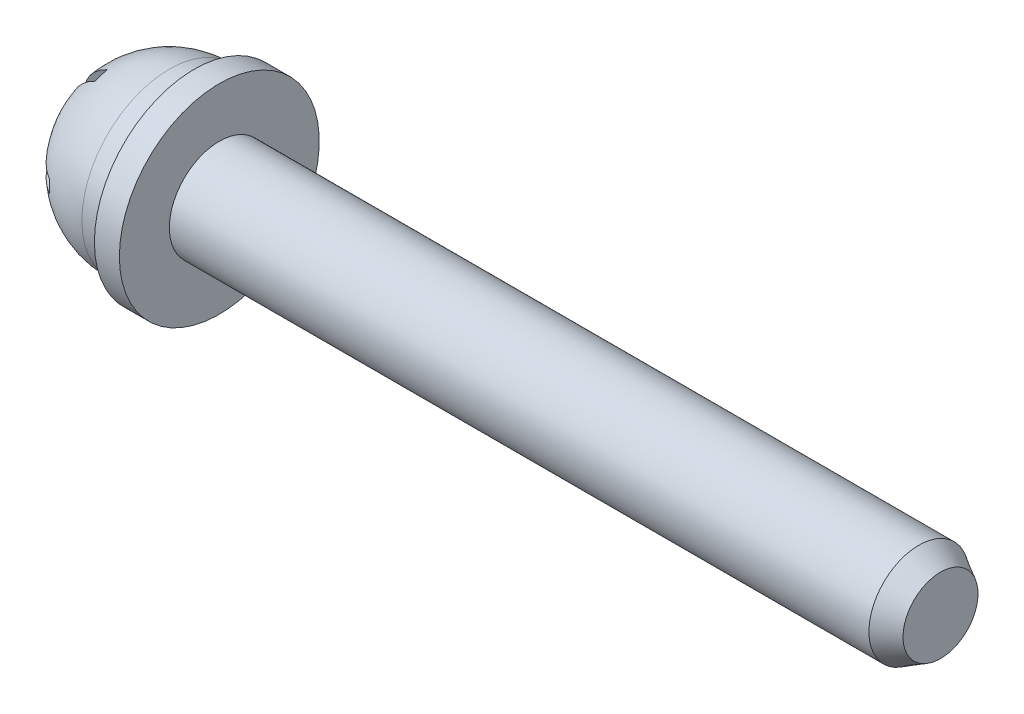
ISO-10303-21;
HEADER;
FILE_DESCRIPTION(('STEP AP214'),'2;1');
FILE_NAME('part.step','',(''),(''),'','','');
FILE_SCHEMA(('AUTOMOTIVE_DESIGN { 1 0 10303 214 1 1 1 1 }'));
ENDSEC;
DATA;
#1=APPLICATION_CONTEXT('core data for automotive mechanical design processes');
#2=APPLICATION_PROTOCOL_DEFINITION('international standard','automotive_design',2000,#1);
#3=PRODUCT_CONTEXT('',#1,'mechanical');
#4=PRODUCT('Part','Part','',(#3));
#5=PRODUCT_RELATED_PRODUCT_CATEGORY('part','',(#4));
#6=PRODUCT_DEFINITION_FORMATION('','',#4);
#7=PRODUCT_DEFINITION_CONTEXT('part definition',#1,'design');
#8=PRODUCT_DEFINITION('design','',#6,#7);
#9=PRODUCT_DEFINITION_SHAPE('','',#8);
#10=(LENGTH_UNIT() NAMED_UNIT(*) SI_UNIT(.MILLI.,.METRE.));
#11=(NAMED_UNIT(*) PLANE_ANGLE_UNIT() SI_UNIT($,.RADIAN.));
#12=(NAMED_UNIT(*) SI_UNIT($,.STERADIAN.) SOLID_ANGLE_UNIT());
#13=UNCERTAINTY_MEASURE_WITH_UNIT(LENGTH_MEASURE(1.E-05),#10,'distance_accuracy_value','');
#14=(GEOMETRIC_REPRESENTATION_CONTEXT(3) GLOBAL_UNCERTAINTY_ASSIGNED_CONTEXT((#13)) GLOBAL_UNIT_ASSIGNED_CONTEXT((#10,
#11,#12)) REPRESENTATION_CONTEXT('',''));
#15=CARTESIAN_POINT('',(0.,0.,0.));
#16=DIRECTION('',(0.,0.,1.));
#17=DIRECTION('',(1.,0.,0.));
#18=AXIS2_PLACEMENT_3D('',#15,#16,#17);
#19=CARTESIAN_POINT('',(-14.,0.,0.));
#20=DIRECTION('',(-1.,0.,0.));
#21=DIRECTION('',(0.,0.,1.));
#22=AXIS2_PLACEMENT_3D('',#19,#20,#21);
#23=CYLINDRICAL_SURFACE('',#22,4.);
#24=CARTESIAN_POINT('',(-14.,0.,0.));
#25=DIRECTION('',(-1.,0.,0.));
#26=DIRECTION('',(0.,0.,1.));
#27=AXIS2_PLACEMENT_3D('',#24,#25,#26);
#28=CIRCLE('',#27,4.);
#29=CARTESIAN_POINT('',(-14.,0.,4.));
#30=VERTEX_POINT('',#29);
#31=EDGE_CURVE('E265',#30,#30,#28,.T.);
#32=ORIENTED_EDGE('',*,*,#31,.T.);
#33=EDGE_LOOP('',(#32));
#34=FACE_BOUND('',#33,.T.);
#35=CARTESIAN_POINT('',(-15.,0.,0.));
#36=DIRECTION('',(-1.,0.,0.));
#37=DIRECTION('',(0.,0.,1.));
#38=AXIS2_PLACEMENT_3D('',#35,#36,#37);
#39=CIRCLE('',#38,4.);
#40=CARTESIAN_POINT('',(-15.,0.,4.));
#41=VERTEX_POINT('',#40);
#42=EDGE_CURVE('E260',#41,#41,#39,.T.);
#43=ORIENTED_EDGE('',*,*,#42,.F.);
#44=EDGE_LOOP('',(#43));
#45=FACE_BOUND('',#44,.T.);
#46=ADVANCED_FACE('F41',(#34,#45),#23,.T.);
#47=CARTESIAN_POINT('',(-14.,4.,0.));
#48=DIRECTION('',(1.,0.,0.));
#49=DIRECTION('',(0.,0.,-1.));
#50=AXIS2_PLACEMENT_3D('',#47,#48,#49);
#51=PLANE('',#50);
#52=CARTESIAN_POINT('',(-14.,0.,0.));
#53=DIRECTION('',(1.,0.,0.));
#54=DIRECTION('',(0.,0.,-1.));
#55=AXIS2_PLACEMENT_3D('',#52,#53,#54);
#56=CIRCLE('',#55,2.);
#57=CARTESIAN_POINT('',(-14.,0.,-2.));
#58=VERTEX_POINT('',#57);
#59=EDGE_CURVE('E261',#58,#58,#56,.T.);
#60=ORIENTED_EDGE('',*,*,#59,.F.);
#61=EDGE_LOOP('',(#60));
#62=FACE_BOUND('',#61,.T.);
#63=ORIENTED_EDGE('',*,*,#31,.F.);
#64=EDGE_LOOP('',(#63));
#65=FACE_BOUND('',#64,.T.);
#66=ADVANCED_FACE('F305',(#62,#65),#51,.T.);
#67=CARTESIAN_POINT('',(-16.,0.,0.));
#68=DIRECTION('',(-1.,0.,0.));
#69=DIRECTION('',(0.,-1.,0.));
#70=AXIS2_PLACEMENT_3D('',#67,#68,#69);
#71=SPHERICAL_SURFACE('',#70,3.5);
#72=CARTESIAN_POINT('',(-16.,-0.0790420021880271,-0.24326626887946));
#73=DIRECTION('',(0.,-0.309016994374951,-0.951056516295152));
#74=DIRECTION('',(0.,0.951056516295152,-0.309016994374951));
#75=AXIS2_PLACEMENT_3D('',#72,#73,#74);
#76=CIRCLE('',#75,3.49064089879145);
#77=CARTESIAN_POINT('',(-19.3320347329356,-1.06837779372166,0.0781884159779941));
#78=VERTEX_POINT('',#77);
#79=CARTESIAN_POINT('',(-17.8027756377323,-2.92182197909651,0.680408937674647));
#80=VERTEX_POINT('',#79);
#81=EDGE_CURVE('E653',#78,#80,#76,.F.);
#82=ORIENTED_EDGE('',*,*,#81,.F.);
#83=CARTESIAN_POINT('',(-19.3320347329356,-1.06837779372166,0.0781884159779942));
#84=CARTESIAN_POINT('',(-19.3405461144038,-1.04245943496157,0.0697921357144864));
#85=CARTESIAN_POINT('',(-19.3485637272138,-1.01707485013839,0.0591778896470313));
#86=CARTESIAN_POINT('',(-19.3634071715776,-0.968073342806507,0.0337375771580438));
#87=CARTESIAN_POINT('',(-19.3702307661986,-0.944459784510841,0.0189037391509382));
#88=CARTESIAN_POINT('',(-19.3824615338861,-0.899755357132787,-0.0147538706880057));
#89=CARTESIAN_POINT('',(-19.3878657129721,-0.878669870607944,-0.0335859271604496));
#90=CARTESIAN_POINT('',(-19.3970428081709,-0.839842146926939,-0.0747322819826078));
#91=CARTESIAN_POINT('',(-19.4008176734612,-0.822095929366334,-0.0970423757363021));
#92=CARTESIAN_POINT('',(-19.4064725235443,-0.791272243557031,-0.143467248510886));
#93=CARTESIAN_POINT('',(-19.4084288146411,-0.778023230661785,-0.167458850329655));
#94=CARTESIAN_POINT('',(-19.4106554136881,-0.755601719092499,-0.217359031424705));
#95=CARTESIAN_POINT('',(-19.4109254248487,-0.746429938285313,-0.243267947341156));
#96=CARTESIAN_POINT('',(-19.4097888634465,-0.73270269490979,-0.295270952938289));
#97=CARTESIAN_POINT('',(-19.4084406241331,-0.727996935995565,-0.321326842908115));
#98=CARTESIAN_POINT('',(-19.4042120872567,-0.722751170861005,-0.373722051421286));
#99=CARTESIAN_POINT('',(-19.401332237719,-0.72220994715014,-0.400061284874824));
#100=CARTESIAN_POINT('',(-19.3941188969929,-0.725235277449738,-0.452432831058541));
#101=CARTESIAN_POINT('',(-19.3897780387944,-0.72882287706069,-0.478462881944793));
#102=CARTESIAN_POINT('',(-19.3797798171811,-0.739940904493872,-0.529415780861787));
#103=CARTESIAN_POINT('',(-19.3741217827723,-0.747473344343214,-0.554338056839096));
#104=CARTESIAN_POINT('',(-19.3626491895066,-0.764678592919861,-0.598628199732745));
#105=CARTESIAN_POINT('',(-19.3570025116572,-0.773820764728144,-0.618249214774664));
#106=CARTESIAN_POINT('',(-19.3450146064505,-0.794420854338748,-0.655950442663824));
#107=CARTESIAN_POINT('',(-19.338674882817,-0.805873802336165,-0.674033845794957));
#108=CARTESIAN_POINT('',(-19.3320347329356,-0.81837779372166,-0.691232468315816));
#109=B_SPLINE_CURVE_WITH_KNOTS('',3,(#83,#84,#85,#86,#87,#88,#89,#90,#91,#92,#93,#94,#95,#96,
#97,#98,#99,#100,#101,#102,#103,#104,#105,#106,#107,#108),.UNSPECIFIED.,.F.,.F.,(4,2,2,2,2,2,2,
2,2,2,2,2,4),(0.,0.0855696068147082,0.171297846455852,0.257205486731491,0.343010067365634,
0.425026080012027,0.507056527274695,0.586216721285477,0.665353772149456,0.744895996839266,
0.824478830828852,0.891409912840858,0.958198551350076),.UNSPECIFIED.);
#110=CARTESIAN_POINT('',(-19.3320347329356,-0.81837779372166,-0.691232468315816));
#111=VERTEX_POINT('',#110);
#112=EDGE_CURVE('E327',#78,#111,#109,.T.);
#113=ORIENTED_EDGE('',*,*,#112,.T.);
#114=CARTESIAN_POINT('',(-16.,-0.206934648267099,0.150346822483875));
#115=DIRECTION('',(0.,-0.80901699437495,0.58778525229247));
#116=DIRECTION('',(0.,-0.58778525229247,-0.80901699437495));
#117=AXIS2_PLACEMENT_3D('',#114,#115,#116);
#118=CIRCLE('',#117,3.49064089879145);
#119=CARTESIAN_POINT('',(-17.8027756377323,-1.96386929653418,-2.26786626284033));
#120=VERTEX_POINT('',#119);
#121=EDGE_CURVE('E650',#120,#111,#118,.F.);
#122=ORIENTED_EDGE('',*,*,#121,.F.);
#123=CARTESIAN_POINT('',(-17.8027756377323,0.,0.));
#124=DIRECTION('',(1.,0.,0.));
#125=DIRECTION('',(0.,0.,-1.));
#126=AXIS2_PLACEMENT_3D('',#123,#124,#125);
#127=CIRCLE('',#126,2.99999999999984);
#128=CARTESIAN_POINT('',(-17.8027756377323,-1.55,-2.56855990780807));
#129=VERTEX_POINT('',#128);
#130=EDGE_CURVE('E646',#129,#120,#127,.F.);
#131=ORIENTED_EDGE('',*,*,#130,.F.);
#132=CARTESIAN_POINT('',(-16.,0.206934648267096,-0.15034682248388));
#133=DIRECTION('',(0.,0.809016994374945,-0.587785252292476));
#134=DIRECTION('',(0.,0.587785252292476,0.809016994374945));
#135=AXIS2_PLACEMENT_3D('',#132,#133,#134);
#136=CIRCLE('',#135,3.49064089879145);
#137=CARTESIAN_POINT('',(-19.3320347329356,-0.404508497187472,-0.991926113283567));
#138=VERTEX_POINT('',#137);
#139=EDGE_CURVE('E645',#138,#129,#136,.F.);
#140=ORIENTED_EDGE('',*,*,#139,.F.);
#141=CARTESIAN_POINT('',(-19.3320347329356,-0.404508497187473,-0.991926113283567));
#142=CARTESIAN_POINT('',(-19.3405461144038,-0.38851394680705,-0.969870882584072));
#143=CARTESIAN_POINT('',(-19.3485637272138,-0.370574930813521,-0.949008690191858));
#144=CARTESIAN_POINT('',(-19.3634071715776,-0.331237457328744,-0.91026697623689));
#145=CARTESIAN_POINT('',(-19.3702307661986,-0.309832648219395,-0.892393055782882));
#146=CARTESIAN_POINT('',(-19.3824615338861,-0.264007931275528,-0.860277392248015));
#147=CARTESIAN_POINT('',(-19.3878657129721,-0.239581807581332,-0.846043328378324));
#148=CARTESIAN_POINT('',(-19.3970428081709,-0.188450872235601,-0.821830891655225));
#149=CARTESIAN_POINT('',(-19.4008176734612,-0.161748829379892,-0.81184743392061));
#150=CARTESIAN_POINT('',(-19.4064725235443,-0.108071108865101,-0.796878441324478));
#151=CARTESIAN_POINT('',(-19.4084288146411,-0.0811595694756792,-0.791691693960253));
#152=CARTESIAN_POINT('',(-19.4106554136881,-0.02677304896644,-0.785787573257854));
#153=CARTESIAN_POINT('',(-19.4109254248487,0.000702030484146031,-0.785070986679164));
#154=CARTESIAN_POINT('',(-19.4097888634465,0.0544017793131907,-0.788085414904193));
#155=CARTESIAN_POINT('',(-19.4084406241331,0.0806365627327904,-0.791661685028945));
#156=CARTESIAN_POINT('',(-19.4042120872567,0.132088397786964,-0.802863675769156));
#157=CARTESIAN_POINT('',(-19.401332237719,0.157305744721586,-0.810488212188117));
#158=CARTESIAN_POINT('',(-19.3941188969929,0.206179166511889,-0.829549170075956));
#159=CARTESIAN_POINT('',(-19.3897780387944,0.229826586777957,-0.841004908152106));
#160=CARTESIAN_POINT('',(-19.3797798171811,0.274850013896313,-0.867324092268802));
#161=CARTESIAN_POINT('',(-19.3741217827723,0.296224854942884,-0.882189275086611));
#162=CARTESIAN_POINT('',(-19.3626491895066,0.333030569746904,-0.912238845697341));
#163=CARTESIAN_POINT('',(-19.3570025116572,0.348866177504591,-0.926996794863539));
#164=CARTESIAN_POINT('',(-19.3450146064505,0.378356398185583,-0.958238964450522));
#165=CARTESIAN_POINT('',(-19.338674882817,0.392015581003345,-0.974719444157908));
#166=CARTESIAN_POINT('',(-19.3320347329356,0.404508497187472,-0.991926113283566));
#167=B_SPLINE_CURVE_WITH_KNOTS('',3,(#141,#142,#143,#144,#145,#146,#147,#148,#149,#150,#151,
#152,#153,#154,#155,#156,#157,#158,#159,#160,#161,#162,#163,#164,#165,#166),.UNSPECIFIED.,.F.,
.F.,(4,2,2,2,2,2,2,2,2,2,2,2,4),(0.,0.0855696068147071,0.171297846455851,0.25720548673149,
0.343010067365634,0.425026080012026,0.507056527274694,0.586216721285476,0.665353772149455,
0.744895996839265,0.824478830828851,0.891409912840858,0.958198551350077),.UNSPECIFIED.);
#168=CARTESIAN_POINT('',(-19.3320347329356,0.404508497187473,-0.991926113283567));
#169=VERTEX_POINT('',#168);
#170=EDGE_CURVE('E314',#138,#169,#167,.T.);
#171=ORIENTED_EDGE('',*,*,#170,.T.);
#172=CARTESIAN_POINT('',(-16.,-0.206934648267096,-0.15034682248388));
#173=DIRECTION('',(0.,-0.809016994374945,-0.587785252292476));
#174=DIRECTION('',(0.,0.587785252292476,-0.809016994374945));
#175=AXIS2_PLACEMENT_3D('',#172,#173,#174);
#176=CIRCLE('',#175,3.49064089879145);
#177=CARTESIAN_POINT('',(-17.8027756377323,1.55,-2.56855990780807));
#178=VERTEX_POINT('',#177);
#179=EDGE_CURVE('E644',#178,#169,#176,.F.);
#180=ORIENTED_EDGE('',*,*,#179,.F.);
#181=CARTESIAN_POINT('',(-17.8027756377323,0.,0.));
#182=DIRECTION('',(1.,0.,0.));
#183=DIRECTION('',(0.,0.,-1.));
#184=AXIS2_PLACEMENT_3D('',#181,#182,#183);
#185=CIRCLE('',#184,2.99999999999984);
#186=CARTESIAN_POINT('',(-17.8027756377323,1.96386929653418,-2.26786626284033));
#187=VERTEX_POINT('',#186);
#188=EDGE_CURVE('E204',#187,#178,#185,.F.);
#189=ORIENTED_EDGE('',*,*,#188,.F.);
#190=CARTESIAN_POINT('',(-16.,0.206934648267099,0.150346822483875));
#191=DIRECTION('',(0.,0.80901699437495,0.58778525229247));
#192=DIRECTION('',(0.,-0.58778525229247,0.80901699437495));
#193=AXIS2_PLACEMENT_3D('',#190,#191,#192);
#194=CIRCLE('',#193,3.49064089879145);
#195=CARTESIAN_POINT('',(-19.3320347329356,0.818377793721661,-0.691232468315817));
#196=VERTEX_POINT('',#195);
#197=EDGE_CURVE('E184',#196,#187,#194,.F.);
#198=ORIENTED_EDGE('',*,*,#197,.F.);
#199=CARTESIAN_POINT('',(-19.3320347329356,0.818377793721661,-0.691232468315817));
#200=CARTESIAN_POINT('',(-19.3405461144038,0.80234461073145,-0.669205305850302));
#201=CARTESIAN_POINT('',(-19.3485637272138,0.788046947516997,-0.645697515804619));
#202=CARTESIAN_POINT('',(-19.3634071715776,0.763357335830252,-0.596313507309036));
#203=CARTESIAN_POINT('',(-19.3702307661986,0.752972677086867,-0.570432978949141));
#204=CARTESIAN_POINT('',(-19.3824615338861,0.736589482304965,-0.516926797474394));
#205=CARTESIAN_POINT('',(-19.3878657129721,0.730600170436545,-0.489297605732444));
#206=CARTESIAN_POINT('',(-19.3970428081709,0.723373102675775,-0.433187142064955));
#207=CARTESIAN_POINT('',(-19.4008176734612,0.722129655169055,-0.40470693210602));
#208=CARTESIAN_POINT('',(-19.4064725235443,0.724480625076509,-0.349030713129682));
#209=CARTESIAN_POINT('',(-19.4084288146411,0.727863858213507,-0.321833525148763));
#210=CARTESIAN_POINT('',(-19.4106554136881,0.739055064848774,-0.268284396785949));
#211=CARTESIAN_POINT('',(-19.4109254248487,0.746863816985655,-0.241932606007986));
#212=CARTESIAN_POINT('',(-19.4097888634465,0.766324843573813,-0.191792619510567));
#213=CARTESIAN_POINT('',(-19.4084406241331,0.777833072500393,-0.167946986030789));
#214=CARTESIAN_POINT('',(-19.4042120872567,0.804386290212864,-0.12247498853673));
#215=CARTESIAN_POINT('',(-19.401332237719,0.819430244013694,-0.100847977738572));
#216=CARTESIAN_POINT('',(-19.3941188969929,0.852661010126209,-0.0602567513876697));
#217=CARTESIAN_POINT('',(-19.3897780387944,0.870863519207843,-0.0413067359986946));
#218=CARTESIAN_POINT('',(-19.3797798171811,0.909807554890172,-0.00661998742198518));
#219=CARTESIAN_POINT('',(-19.3741217827723,0.930550373010422,0.00911510032493676));
#220=CARTESIAN_POINT('',(-19.3626491895066,0.970502804316189,0.0348335872338156));
#221=CARTESIAN_POINT('',(-19.3570025116572,0.989431919951236,0.045333688086782));
#222=CARTESIAN_POINT('',(-19.3450146064505,1.02825796827843,0.0637261932889001));
#223=CARTESIAN_POINT('',(-19.338674882817,1.04815275551577,0.0716240998099655));
#224=CARTESIAN_POINT('',(-19.3320347329356,1.06837779372166,0.0781884159779941));
#225=B_SPLINE_CURVE_WITH_KNOTS('',3,(#199,#200,#201,#202,#203,#204,#205,#206,#207,#208,#209,
#210,#211,#212,#213,#214,#215,#216,#217,#218,#219,#220,#221,#222,#223,#224),.UNSPECIFIED.,.F.,
.F.,(4,2,2,2,2,2,2,2,2,2,2,2,4),(0.,0.085569606814707,0.171297846455851,0.25720548673149,
0.343010067365633,0.425026080012025,0.507056527274693,0.586216721285475,0.665353772149453,
0.744895996839263,0.824478830828849,0.891409912840858,0.958198551350078),.UNSPECIFIED.);
#226=CARTESIAN_POINT('',(-19.3320347329356,1.06837779372166,0.078188415977994));
#227=VERTEX_POINT('',#226);
#228=EDGE_CURVE('E293',#196,#227,#225,.T.);
#229=ORIENTED_EDGE('',*,*,#228,.T.);
#230=CARTESIAN_POINT('',(-16.,0.0790420021880266,-0.24326626887946));
#231=DIRECTION('',(0.,0.30901699437495,-0.951056516295152));
#232=DIRECTION('',(0.,0.951056516295153,0.30901699437495));
#233=AXIS2_PLACEMENT_3D('',#230,#231,#232);
#234=CIRCLE('',#233,3.49064089879145);
#235=CARTESIAN_POINT('',(-17.8027756377323,2.92182197909651,0.680408937674644));
#236=VERTEX_POINT('',#235);
#237=EDGE_CURVE('E239',#236,#227,#234,.F.);
#238=ORIENTED_EDGE('',*,*,#237,.F.);
#239=CARTESIAN_POINT('',(-17.8027756377323,0.,0.));
#240=DIRECTION('',(1.,0.,0.));
#241=DIRECTION('',(0.,0.,-1.));
#242=AXIS2_PLACEMENT_3D('',#239,#240,#241);
#243=CIRCLE('',#242,2.99999999999984);
#244=CARTESIAN_POINT('',(-17.8027756377323,2.76373797472047,1.16694147543354));
#245=VERTEX_POINT('',#244);
#246=EDGE_CURVE('E614',#245,#236,#243,.F.);
#247=ORIENTED_EDGE('',*,*,#246,.F.);
#248=CARTESIAN_POINT('',(-16.,-0.0790420021880264,0.24326626887946));
#249=DIRECTION('',(0.,-0.309016994374944,0.951056516295155));
#250=DIRECTION('',(0.,-0.951056516295155,-0.309016994374944));
#251=AXIS2_PLACEMENT_3D('',#248,#249,#250);
#252=CIRCLE('',#251,3.49064089879145);
#253=CARTESIAN_POINT('',(-19.3320347329356,0.910293789345609,0.564720953736907));
#254=VERTEX_POINT('',#253);
#255=EDGE_CURVE('E667',#254,#245,#252,.F.);
#256=ORIENTED_EDGE('',*,*,#255,.F.);
#257=CARTESIAN_POINT('',(-19.3320347329356,0.910293789345609,0.564720953736907));
#258=CARTESIAN_POINT('',(-19.3405461144038,0.88439018692939,0.556279258116816));
#259=CARTESIAN_POINT('',(-19.3485637272138,0.857614729109629,0.549945678973231));
#260=CARTESIAN_POINT('',(-19.3634071715776,0.803018236433406,0.541724960769247));
#261=CARTESIAN_POINT('',(-19.3702307661986,0.775195355259076,0.539846086488459));
#262=CARTESIAN_POINT('',(-19.3824615338861,0.719245267095685,0.540799061713207));
#263=CARTESIAN_POINT('',(-19.3878657129721,0.691117545097581,0.543640777421728));
#264=CARTESIAN_POINT('',(-19.3970428081709,0.635520036236696,0.554106514369654));
#265=CARTESIAN_POINT('',(-19.4008176734612,0.608049500558608,0.561724794396394));
#266=CARTESIAN_POINT('',(-19.4064725235443,0.555824759353152,0.581165597492721));
#267=CARTESIAN_POINT('',(-19.4084288146411,0.53100417303426,0.592787636699124));
#268=CARTESIAN_POINT('',(-19.4106554136881,0.483534198600739,0.619978697392875));
#269=CARTESIAN_POINT('',(-19.4109254248487,0.460885193380469,0.635548413179393));
#270=CARTESIAN_POINT('',(-19.4097888634465,0.419213020438871,0.669551057255288));
#271=CARTESIAN_POINT('',(-19.4084406241331,0.400090713646213,0.687864739353815));
#272=CARTESIAN_POINT('',(-19.4042120872567,0.365049669649023,0.727169970081705));
#273=CARTESIAN_POINT('',(-19.401332237719,0.349129997488497,0.748160734248989));
#274=CARTESIAN_POINT('',(-19.3941188969929,0.320794318627926,0.792308449666725));
#275=CARTESIAN_POINT('',(-19.3897780387944,0.308396667654837,0.815475941340596));
#276=CARTESIAN_POINT('',(-19.3797798171811,0.28744197824725,0.86323271503692));
#277=CARTESIAN_POINT('',(-19.3741217827723,0.27888690382145,0.887822716898289));
#278=CARTESIAN_POINT('',(-19.3626491895066,0.26677314949759,0.933767186557925));
#279=CARTESIAN_POINT('',(-19.3570025116572,0.262636378579338,0.955014554936558));
#280=CARTESIAN_POINT('',(-19.3450146064505,0.257141975413397,0.997623917876708));
#281=CARTESIAN_POINT('',(-19.338674882817,0.25577844730726,1.01898557225408));
#282=CARTESIAN_POINT('',(-19.3320347329356,0.255785292158138,1.04024921188448));
#283=B_SPLINE_CURVE_WITH_KNOTS('',3,(#257,#258,#259,#260,#261,#262,#263,#264,#265,#266,#267,
#268,#269,#270,#271,#272,#273,#274,#275,#276,#277,#278,#279,#280,#281,#282),.UNSPECIFIED.,.F.,
.F.,(4,2,2,2,2,2,2,2,2,2,2,2,4),(0.,0.085569606814708,0.171297846455852,0.257205486731492,
0.343010067365634,0.425026080012027,0.507056527274696,0.586216721285477,0.665353772149456,
0.744895996839266,0.824478830828852,0.891409912840859,0.958198551350077),.UNSPECIFIED.);
#284=CARTESIAN_POINT('',(-19.3320347329356,0.255785292158138,1.04024921188448));
#285=VERTEX_POINT('',#284);
#286=EDGE_CURVE('E286',#254,#285,#283,.T.);
#287=ORIENTED_EDGE('',*,*,#286,.T.);
#288=CARTESIAN_POINT('',(-16.,0.255785292158141,0.));
#289=DIRECTION('',(0.,1.,0.));
#290=DIRECTION('',(0.,0.,1.));
#291=AXIS2_PLACEMENT_3D('',#288,#289,#290);
#292=CIRCLE('',#291,3.49064089879145);
#293=CARTESIAN_POINT('',(-17.8027756377323,0.25578529215813,2.98907575754021));
#294=VERTEX_POINT('',#293);
#295=EDGE_CURVE('E664',#294,#285,#292,.F.);
#296=ORIENTED_EDGE('',*,*,#295,.F.);
#297=CARTESIAN_POINT('',(-17.8027756377323,0.,0.));
#298=DIRECTION('',(1.,0.,0.));
#299=DIRECTION('',(0.,0.,-1.));
#300=AXIS2_PLACEMENT_3D('',#297,#298,#299);
#301=CIRCLE('',#300,2.99999999999983);
#302=CARTESIAN_POINT('',(-17.8027756377323,-0.25578529215813,2.98907575754021));
#303=VERTEX_POINT('',#302);
#304=EDGE_CURVE('E662',#303,#294,#301,.F.);
#305=ORIENTED_EDGE('',*,*,#304,.F.);
#306=CARTESIAN_POINT('',(-16.,-0.255785292158142,0.));
#307=DIRECTION('',(0.,-1.,0.));
#308=DIRECTION('',(0.,0.,-1.));
#309=AXIS2_PLACEMENT_3D('',#306,#307,#308);
#310=CIRCLE('',#309,3.49064089879145);
#311=CARTESIAN_POINT('',(-19.3320347329356,-0.255785292158138,1.04024921188448));
#312=VERTEX_POINT('',#311);
#313=EDGE_CURVE('E660',#312,#303,#310,.F.);
#314=ORIENTED_EDGE('',*,*,#313,.F.);
#315=CARTESIAN_POINT('',(-19.3320347329356,-0.255785292158138,1.04024921188448));
#316=CARTESIAN_POINT('',(-19.3405461144038,-0.255761415892214,1.01300479460307));
#317=CARTESIAN_POINT('',(-19.3485637272138,-0.258011895674712,0.985582637376213));
#318=CARTESIAN_POINT('',(-19.3634071715776,-0.267064772128407,0.931117945618633));
#319=CARTESIAN_POINT('',(-19.3702307661986,-0.273875599615707,0.904076209092623));
#320=CARTESIAN_POINT('',(-19.3824615338861,-0.292071460992335,0.851158998697206));
#321=CARTESIAN_POINT('',(-19.3878657129721,-0.303466037344851,0.825286083849487));
#322=CARTESIAN_POINT('',(-19.3970428081709,-0.330600119749932,0.775643801333131));
#323=CARTESIAN_POINT('',(-19.4008176734612,-0.346334396981437,0.751871947366536));
#324=CARTESIAN_POINT('',(-19.4064725235443,-0.38096203200753,0.708210805472322));
#325=CARTESIAN_POINT('',(-19.4084288146411,-0.399685231110305,0.688196432739544));
#326=CARTESIAN_POINT('',(-19.4106554136881,-0.440214495390576,0.651452304075629));
#327=CARTESIAN_POINT('',(-19.4109254248487,-0.462021102564958,0.63472312684891));
#328=CARTESIAN_POINT('',(-19.4097888634465,-0.507236948416088,0.605597930097759));
#329=CARTESIAN_POINT('',(-19.4084406241331,-0.530563412883833,0.593070774614031));
#330=CARTESIAN_POINT('',(-19.4042120872567,-0.578773186787849,0.571890745645465));
#331=CARTESIAN_POINT('',(-19.401332237719,-0.60365603907364,0.563236740552522));
#332=CARTESIAN_POINT('',(-19.3941188969929,-0.65439921781629,0.549930302855439));
#333=CARTESIAN_POINT('',(-19.3897780387944,-0.680263896579951,0.545298584754996));
#334=CARTESIAN_POINT('',(-19.3797798171811,-0.732158642539867,0.540127145515652));
#335=CARTESIAN_POINT('',(-19.3741217827723,-0.758188787431546,0.539589514702479));
#336=CARTESIAN_POINT('',(-19.3626491895066,-0.805627930640824,0.542266271638344));
#337=CARTESIAN_POINT('',(-19.3570025116572,-0.827113711307022,0.544897766614863));
#338=CARTESIAN_POINT('',(-19.3450146064505,-0.86933548753866,0.552839295948739));
#339=CARTESIAN_POINT('',(-19.338674882817,-0.89007298149021,0.558143617888819));
#340=CARTESIAN_POINT('',(-19.3320347329356,-0.910293789345609,0.564720953736907));
#341=B_SPLINE_CURVE_WITH_KNOTS('',3,(#315,#316,#317,#318,#319,#320,#321,#322,#323,#324,#325,
#326,#327,#328,#329,#330,#331,#332,#333,#334,#335,#336,#337,#338,#339,#340),.UNSPECIFIED.,.F.,
.F.,(4,2,2,2,2,2,2,2,2,2,2,2,4),(0.,0.0855696068147086,0.171297846455852,0.257205486731492,
0.343010067365636,0.425026080012029,0.507056527274697,0.586216721285479,0.665353772149458,
0.744895996839268,0.824478830828854,0.891409912840861,0.958198551350077),.UNSPECIFIED.);
#342=CARTESIAN_POINT('',(-19.3320347329356,-0.910293789345609,0.564720953736907));
#343=VERTEX_POINT('',#342);
#344=EDGE_CURVE('E321',#312,#343,#341,.T.);
#345=ORIENTED_EDGE('',*,*,#344,.T.);
#346=CARTESIAN_POINT('',(-16.,0.0790420021880264,0.24326626887946));
#347=DIRECTION('',(0.,0.309016994374944,0.951056516295155));
#348=DIRECTION('',(0.,-0.951056516295155,0.309016994374944));
#349=AXIS2_PLACEMENT_3D('',#346,#347,#348);
#350=CIRCLE('',#349,3.49064089879145);
#351=CARTESIAN_POINT('',(-17.8027756377323,-2.76373797472047,1.16694147543354));
#352=VERTEX_POINT('',#351);
#353=EDGE_CURVE('E657',#352,#343,#350,.F.);
#354=ORIENTED_EDGE('',*,*,#353,.F.);
#355=CARTESIAN_POINT('',(-17.8027756377323,0.,0.));
#356=DIRECTION('',(1.,0.,0.));
#357=DIRECTION('',(0.,0.,-1.));
#358=AXIS2_PLACEMENT_3D('',#355,#356,#357);
#359=CIRCLE('',#358,2.99999999999984);
#360=EDGE_CURVE('E655',#80,#352,#359,.F.);
#361=ORIENTED_EDGE('',*,*,#360,.F.);
#362=EDGE_LOOP('',(#82,#113,#122,#131,#140,#171,#180,#189,#198,#229,#238,#247,#256,#287,#296,
#305,#314,#345,#354,#361));
#363=FACE_BOUND('',#362,.T.);
#364=CARTESIAN_POINT('',(-16.,0.,0.));
#365=DIRECTION('',(-1.,0.,0.));
#366=DIRECTION('',(0.,0.,1.));
#367=AXIS2_PLACEMENT_3D('',#364,#365,#366);
#368=CIRCLE('',#367,3.5);
#369=CARTESIAN_POINT('',(-16.,0.,3.5));
#370=VERTEX_POINT('',#369);
#371=EDGE_CURVE('E271',#370,#370,#368,.T.);
#372=ORIENTED_EDGE('',*,*,#371,.T.);
#373=EDGE_LOOP('',(#372));
#374=FACE_BOUND('',#373,.T.);
#375=ADVANCED_FACE('F299',(#363,#374),#71,.T.);
#376=CARTESIAN_POINT('',(-14.,0.,0.));
#377=DIRECTION('',(-1.,0.,0.));
#378=DIRECTION('',(0.,0.,1.));
#379=AXIS2_PLACEMENT_3D('',#376,#377,#378);
#380=CYLINDRICAL_SURFACE('',#379,3.5);
#381=CARTESIAN_POINT('',(-15.,0.,0.));
#382=DIRECTION('',(-1.,0.,0.));
#383=DIRECTION('',(0.,0.,1.));
#384=AXIS2_PLACEMENT_3D('',#381,#382,#383);
#385=CIRCLE('',#384,3.5);
#386=CARTESIAN_POINT('',(-15.,0.,3.5));
#387=VERTEX_POINT('',#386);
#388=EDGE_CURVE('E268',#387,#387,#385,.T.);
#389=ORIENTED_EDGE('',*,*,#388,.T.);
#390=EDGE_LOOP('',(#389));
#391=FACE_BOUND('',#390,.T.);
#392=ORIENTED_EDGE('',*,*,#371,.F.);
#393=EDGE_LOOP('',(#392));
#394=FACE_BOUND('',#393,.T.);
#395=ADVANCED_FACE('F304',(#391,#394),#380,.T.);
#396=CARTESIAN_POINT('',(-15.,3.5,0.));
#397=DIRECTION('',(-1.,0.,0.));
#398=DIRECTION('',(0.,0.,1.));
#399=AXIS2_PLACEMENT_3D('',#396,#397,#398);
#400=PLANE('',#399);
#401=ORIENTED_EDGE('',*,*,#42,.T.);
#402=EDGE_LOOP('',(#401));
#403=FACE_BOUND('',#402,.T.);
#404=ORIENTED_EDGE('',*,*,#388,.F.);
#405=EDGE_LOOP('',(#404));
#406=FACE_BOUND('',#405,.T.);
#407=ADVANCED_FACE('F387',(#403,#406),#400,.T.);
#408=CARTESIAN_POINT('',(14.8660254037844,0.,0.));
#409=DIRECTION('',(-1.,0.,0.));
#410=DIRECTION('',(0.,0.,1.));
#411=AXIS2_PLACEMENT_3D('',#408,#409,#410);
#412=CYLINDRICAL_SURFACE('',#411,2.);
#413=CARTESIAN_POINT('',(14.,0.,0.));
#414=DIRECTION('',(1.,0.,0.));
#415=DIRECTION('',(0.,0.,-1.));
#416=AXIS2_PLACEMENT_3D('',#413,#414,#415);
#417=CIRCLE('',#416,2.);
#418=CARTESIAN_POINT('',(14.,0.,-2.));
#419=VERTEX_POINT('',#418);
#420=EDGE_CURVE('E278',#419,#419,#417,.F.);
#421=ORIENTED_EDGE('',*,*,#420,.T.);
#422=EDGE_LOOP('',(#421));
#423=FACE_BOUND('',#422,.T.);
#424=ORIENTED_EDGE('',*,*,#59,.T.);
#425=EDGE_LOOP('',(#424));
#426=FACE_BOUND('',#425,.T.);
#427=ADVANCED_FACE('F379',(#423,#426),#412,.T.);
#428=CARTESIAN_POINT('',(14.8660254037844,0.,0.));
#429=DIRECTION('',(1.,0.,0.));
#430=DIRECTION('',(0.,0.,-1.));
#431=AXIS2_PLACEMENT_3D('',#428,#429,#430);
#432=PLANE('',#431);
#433=CARTESIAN_POINT('',(14.8660254037844,0.,0.));
#434=DIRECTION('',(1.,0.,0.));
#435=DIRECTION('',(0.,0.,-1.));
#436=AXIS2_PLACEMENT_3D('',#433,#434,#435);
#437=CIRCLE('',#436,1.49999999999998);
#438=CARTESIAN_POINT('',(14.8660254037844,0.,-1.49999999999998));
#439=VERTEX_POINT('',#438);
#440=EDGE_CURVE('E264',#439,#439,#437,.T.);
#441=ORIENTED_EDGE('',*,*,#440,.T.);
#442=EDGE_LOOP('',(#441));
#443=FACE_BOUND('',#442,.T.);
#444=ADVANCED_FACE('F378',(#443),#432,.T.);
#445=CARTESIAN_POINT('',(-32.5389553381563,0.,0.));
#446=DIRECTION('',(1.,0.,0.));
#447=DIRECTION('',(0.,0.,-1.));
#448=AXIS2_PLACEMENT_3D('',#445,#446,#447);
#449=CYLINDRICAL_SURFACE('',#448,2.99999999999984);
#450=ORIENTED_EDGE('',*,*,#188,.T.);
#451=DIRECTION('',(1.,0.,0.));
#452=VECTOR('',#451,1.);
#453=CARTESIAN_POINT('',(-32.5389553381563,1.55,-2.56855990780807));
#454=LINE('',#453,#452);
#455=CARTESIAN_POINT('',(-16.,1.55,-2.56855990780807));
#456=VERTEX_POINT('',#455);
#457=EDGE_CURVE('E201',#178,#456,#454,.T.);
#458=ORIENTED_EDGE('',*,*,#457,.T.);
#459=CARTESIAN_POINT('',(-16.,0.,0.));
#460=DIRECTION('',(1.,0.,0.));
#461=DIRECTION('',(0.,0.,-1.));
#462=AXIS2_PLACEMENT_3D('',#459,#460,#461);
#463=CIRCLE('',#462,2.99999999999984);
#464=CARTESIAN_POINT('',(-16.,1.96386929653418,-2.26786626284033));
#465=VERTEX_POINT('',#464);
#466=EDGE_CURVE('E194',#456,#465,#463,.T.);
#467=ORIENTED_EDGE('',*,*,#466,.T.);
#468=DIRECTION('',(1.,0.,0.));
#469=VECTOR('',#468,1.);
#470=CARTESIAN_POINT('',(-32.5389553381563,1.96386929653418,-2.26786626284033));
#471=LINE('',#470,#469);
#472=EDGE_CURVE('E178',#187,#465,#471,.T.);
#473=ORIENTED_EDGE('',*,*,#472,.F.);
#474=EDGE_LOOP('',(#450,#458,#467,#473));
#475=FACE_BOUND('',#474,.T.);
#476=ADVANCED_FACE('F199',(#475),#449,.F.);
#477=CARTESIAN_POINT('',(-32.5389553381563,0.,-0.435167931077769));
#478=DIRECTION('',(0.,-0.809016994374945,-0.587785252292476));
#479=DIRECTION('',(0.,0.587785252292476,-0.809016994374945));
#480=AXIS2_PLACEMENT_3D('',#477,#478,#479);
#481=PLANE('',#480);
#482=ORIENTED_EDGE('',*,*,#179,.T.);
#483=DIRECTION('',(1.,0.,0.));
#484=VECTOR('',#483,1.);
#485=CARTESIAN_POINT('',(-32.5389553381563,0.404508497187473,-0.991926113283567));
#486=LINE('',#485,#484);
#487=CARTESIAN_POINT('',(-16.,0.404508497187473,-0.991926113283567));
#488=VERTEX_POINT('',#487);
#489=EDGE_CURVE('E621',#169,#488,#486,.T.);
#490=ORIENTED_EDGE('',*,*,#489,.T.);
#491=DIRECTION('',(0.,0.587785252292476,-0.809016994374945));
#492=VECTOR('',#491,1.);
#493=CARTESIAN_POINT('',(-16.,0.,-0.435167931077769));
#494=LINE('',#493,#492);
#495=EDGE_CURVE('E189',#488,#456,#494,.T.);
#496=ORIENTED_EDGE('',*,*,#495,.T.);
#497=ORIENTED_EDGE('',*,*,#457,.F.);
#498=EDGE_LOOP('',(#482,#490,#496,#497));
#499=FACE_BOUND('',#498,.T.);
#500=ADVANCED_FACE('F385',(#499),#481,.F.);
#501=CARTESIAN_POINT('',(-32.5389553381563,-1.55,-2.56855990780807));
#502=DIRECTION('',(0.,0.809016994374945,-0.587785252292476));
#503=DIRECTION('',(0.,0.587785252292476,0.809016994374945));
#504=AXIS2_PLACEMENT_3D('',#501,#502,#503);
#505=PLANE('',#504);
#506=DIRECTION('',(0.,0.587785252292476,0.809016994374945));
#507=VECTOR('',#506,1.);
#508=CARTESIAN_POINT('',(-16.,-1.55,-2.56855990780807));
#509=LINE('',#508,#507);
#510=CARTESIAN_POINT('',(-16.,-1.55,-2.56855990780807));
#511=VERTEX_POINT('',#510);
#512=CARTESIAN_POINT('',(-16.,-0.404508497187473,-0.991926113283567));
#513=VERTEX_POINT('',#512);
#514=EDGE_CURVE('E234',#511,#513,#509,.T.);
#515=ORIENTED_EDGE('',*,*,#514,.T.);
#516=DIRECTION('',(1.,0.,0.));
#517=VECTOR('',#516,1.);
#518=CARTESIAN_POINT('',(-32.5389553381563,-0.404508497187473,-0.991926113283567));
#519=LINE('',#518,#517);
#520=EDGE_CURVE('E617',#513,#138,#519,.F.);
#521=ORIENTED_EDGE('',*,*,#520,.T.);
#522=ORIENTED_EDGE('',*,*,#139,.T.);
#523=DIRECTION('',(1.,0.,0.));
#524=VECTOR('',#523,1.);
#525=CARTESIAN_POINT('',(-32.5389553381563,-1.55,-2.56855990780807));
#526=LINE('',#525,#524);
#527=EDGE_CURVE('E240',#129,#511,#526,.T.);
#528=ORIENTED_EDGE('',*,*,#527,.T.);
#529=EDGE_LOOP('',(#515,#521,#522,#528));
#530=FACE_BOUND('',#529,.T.);
#531=ADVANCED_FACE('F441',(#530),#505,.F.);
#532=CARTESIAN_POINT('',(-32.5389553381563,0.,0.));
#533=DIRECTION('',(1.,0.,0.));
#534=DIRECTION('',(0.,0.,-1.));
#535=AXIS2_PLACEMENT_3D('',#532,#533,#534);
#536=CYLINDRICAL_SURFACE('',#535,2.99999999999984);
#537=ORIENTED_EDGE('',*,*,#130,.T.);
#538=DIRECTION('',(1.,0.,0.));
#539=VECTOR('',#538,1.);
#540=CARTESIAN_POINT('',(-32.5389553381563,-1.96386929653418,-2.26786626284033));
#541=LINE('',#540,#539);
#542=CARTESIAN_POINT('',(-16.,-1.96386929653418,-2.26786626284033));
#543=VERTEX_POINT('',#542);
#544=EDGE_CURVE('E242',#120,#543,#541,.T.);
#545=ORIENTED_EDGE('',*,*,#544,.T.);
#546=CARTESIAN_POINT('',(-16.,0.,0.));
#547=DIRECTION('',(1.,0.,0.));
#548=DIRECTION('',(0.,0.,-1.));
#549=AXIS2_PLACEMENT_3D('',#546,#547,#548);
#550=CIRCLE('',#549,2.99999999999984);
#551=EDGE_CURVE('E231',#543,#511,#550,.T.);
#552=ORIENTED_EDGE('',*,*,#551,.T.);
#553=ORIENTED_EDGE('',*,*,#527,.F.);
#554=EDGE_LOOP('',(#537,#545,#552,#553));
#555=FACE_BOUND('',#554,.T.);
#556=ADVANCED_FACE('F451',(#555),#536,.F.);
#557=CARTESIAN_POINT('',(-32.5389553381563,-0.413869296534193,-0.134474286110017));
#558=DIRECTION('',(0.,-0.80901699437495,0.58778525229247));
#559=DIRECTION('',(0.,-0.58778525229247,-0.80901699437495));
#560=AXIS2_PLACEMENT_3D('',#557,#558,#559);
#561=PLANE('',#560);
#562=ORIENTED_EDGE('',*,*,#121,.T.);
#563=DIRECTION('',(1.,0.,0.));
#564=VECTOR('',#563,1.);
#565=CARTESIAN_POINT('',(-32.5389553381563,-0.818377793721661,-0.691232468315817));
#566=LINE('',#565,#564);
#567=CARTESIAN_POINT('',(-16.,-0.81837779372166,-0.691232468315817));
#568=VERTEX_POINT('',#567);
#569=EDGE_CURVE('E281',#111,#568,#566,.T.);
#570=ORIENTED_EDGE('',*,*,#569,.T.);
#571=DIRECTION('',(0.,-0.58778525229247,-0.80901699437495));
#572=VECTOR('',#571,1.);
#573=CARTESIAN_POINT('',(-16.,-0.413869296534193,-0.134474286110017));
#574=LINE('',#573,#572);
#575=EDGE_CURVE('E229',#568,#543,#574,.T.);
#576=ORIENTED_EDGE('',*,*,#575,.T.);
#577=ORIENTED_EDGE('',*,*,#544,.F.);
#578=EDGE_LOOP('',(#562,#570,#576,#577));
#579=FACE_BOUND('',#578,.T.);
#580=ADVANCED_FACE('F461',(#579),#561,.F.);
#581=CARTESIAN_POINT('',(-32.5389553381563,-2.92182197909651,0.680408937674647));
#582=DIRECTION('',(0.,-0.309016994374951,-0.951056516295152));
#583=DIRECTION('',(0.,0.951056516295152,-0.309016994374951));
#584=AXIS2_PLACEMENT_3D('',#581,#582,#583);
#585=PLANE('',#584);
#586=DIRECTION('',(0.,0.951056516295152,-0.309016994374951));
#587=VECTOR('',#586,1.);
#588=CARTESIAN_POINT('',(-16.,-2.92182197909651,0.680408937674647));
#589=LINE('',#588,#587);
#590=CARTESIAN_POINT('',(-16.,-2.92182197909651,0.680408937674647));
#591=VERTEX_POINT('',#590);
#592=CARTESIAN_POINT('',(-16.,-1.06837779372166,0.0781884159779942));
#593=VERTEX_POINT('',#592);
#594=EDGE_CURVE('E226',#591,#593,#589,.T.);
#595=ORIENTED_EDGE('',*,*,#594,.T.);
#596=DIRECTION('',(1.,0.,0.));
#597=VECTOR('',#596,1.);
#598=CARTESIAN_POINT('',(-32.5389553381563,-1.06837779372166,0.0781884159779942));
#599=LINE('',#598,#597);
#600=EDGE_CURVE('E284',#593,#78,#599,.F.);
#601=ORIENTED_EDGE('',*,*,#600,.T.);
#602=ORIENTED_EDGE('',*,*,#81,.T.);
#603=DIRECTION('',(1.,0.,0.));
#604=VECTOR('',#603,1.);
#605=CARTESIAN_POINT('',(-32.5389553381563,-2.92182197909651,0.680408937674647));
#606=LINE('',#605,#604);
#607=EDGE_CURVE('E245',#80,#591,#606,.T.);
#608=ORIENTED_EDGE('',*,*,#607,.T.);
#609=EDGE_LOOP('',(#595,#601,#602,#608));
#610=FACE_BOUND('',#609,.T.);
#611=ADVANCED_FACE('F471',(#610),#585,.F.);
#612=CARTESIAN_POINT('',(-32.5389553381563,0.,0.));
#613=DIRECTION('',(1.,0.,0.));
#614=DIRECTION('',(0.,0.,-1.));
#615=AXIS2_PLACEMENT_3D('',#612,#613,#614);
#616=CYLINDRICAL_SURFACE('',#615,2.99999999999984);
#617=ORIENTED_EDGE('',*,*,#360,.T.);
#618=DIRECTION('',(1.,0.,0.));
#619=VECTOR('',#618,1.);
#620=CARTESIAN_POINT('',(-32.5389553381563,-2.76373797472047,1.16694147543354));
#621=LINE('',#620,#619);
#622=CARTESIAN_POINT('',(-16.,-2.76373797472047,1.16694147543354));
#623=VERTEX_POINT('',#622);
#624=EDGE_CURVE('E247',#352,#623,#621,.T.);
#625=ORIENTED_EDGE('',*,*,#624,.T.);
#626=CARTESIAN_POINT('',(-16.,0.,0.));
#627=DIRECTION('',(1.,0.,0.));
#628=DIRECTION('',(0.,0.,-1.));
#629=AXIS2_PLACEMENT_3D('',#626,#627,#628);
#630=CIRCLE('',#629,2.99999999999984);
#631=EDGE_CURVE('E223',#623,#591,#630,.T.);
#632=ORIENTED_EDGE('',*,*,#631,.T.);
#633=ORIENTED_EDGE('',*,*,#607,.F.);
#634=EDGE_LOOP('',(#617,#625,#632,#633));
#635=FACE_BOUND('',#634,.T.);
#636=ADVANCED_FACE('F481',(#635),#616,.F.);
#637=CARTESIAN_POINT('',(-32.5389553381563,-0.25578529215814,0.352058251648901));
#638=DIRECTION('',(0.,0.309016994374944,0.951056516295155));
#639=DIRECTION('',(0.,-0.951056516295155,0.309016994374944));
#640=AXIS2_PLACEMENT_3D('',#637,#638,#639);
#641=PLANE('',#640);
#642=ORIENTED_EDGE('',*,*,#353,.T.);
#643=DIRECTION('',(1.,0.,0.));
#644=VECTOR('',#643,1.);
#645=CARTESIAN_POINT('',(-32.5389553381563,-0.910293789345609,0.564720953736907));
#646=LINE('',#645,#644);
#647=CARTESIAN_POINT('',(-16.,-0.910293789345609,0.564720953736907));
#648=VERTEX_POINT('',#647);
#649=EDGE_CURVE('E686',#343,#648,#646,.T.);
#650=ORIENTED_EDGE('',*,*,#649,.T.);
#651=DIRECTION('',(0.,-0.951056516295155,0.309016994374944));
#652=VECTOR('',#651,1.);
#653=CARTESIAN_POINT('',(-16.,-0.25578529215814,0.352058251648901));
#654=LINE('',#653,#652);
#655=EDGE_CURVE('E221',#648,#623,#654,.T.);
#656=ORIENTED_EDGE('',*,*,#655,.T.);
#657=ORIENTED_EDGE('',*,*,#624,.F.);
#658=EDGE_LOOP('',(#642,#650,#656,#657));
#659=FACE_BOUND('',#658,.T.);
#660=ADVANCED_FACE('F491',(#659),#641,.F.);
#661=CARTESIAN_POINT('',(-32.5389553381563,-0.25578529215813,2.98907575754021));
#662=DIRECTION('',(0.,-1.,0.));
#663=DIRECTION('',(0.,0.,-1.));
#664=AXIS2_PLACEMENT_3D('',#661,#662,#663);
#665=PLANE('',#664);
#666=DIRECTION('',(0.,0.,-1.));
#667=VECTOR('',#666,1.);
#668=CARTESIAN_POINT('',(-16.,-0.25578529215813,2.98907575754021));
#669=LINE('',#668,#667);
#670=CARTESIAN_POINT('',(-16.,-0.25578529215813,2.98907575754021));
#671=VERTEX_POINT('',#670);
#672=CARTESIAN_POINT('',(-16.,-0.255785292158138,1.04024921188448));
#673=VERTEX_POINT('',#672);
#674=EDGE_CURVE('E218',#671,#673,#669,.T.);
#675=ORIENTED_EDGE('',*,*,#674,.T.);
#676=DIRECTION('',(1.,0.,0.));
#677=VECTOR('',#676,1.);
#678=CARTESIAN_POINT('',(-32.5389553381563,-0.255785292158138,1.04024921188448));
#679=LINE('',#678,#677);
#680=EDGE_CURVE('E684',#673,#312,#679,.F.);
#681=ORIENTED_EDGE('',*,*,#680,.T.);
#682=ORIENTED_EDGE('',*,*,#313,.T.);
#683=DIRECTION('',(1.,0.,0.));
#684=VECTOR('',#683,1.);
#685=CARTESIAN_POINT('',(-32.5389553381563,-0.25578529215813,2.98907575754021));
#686=LINE('',#685,#684);
#687=EDGE_CURVE('E250',#303,#671,#686,.T.);
#688=ORIENTED_EDGE('',*,*,#687,.T.);
#689=EDGE_LOOP('',(#675,#681,#682,#688));
#690=FACE_BOUND('',#689,.T.);
#691=ADVANCED_FACE('F501',(#690),#665,.F.);
#692=CARTESIAN_POINT('',(-32.5389553381563,0.,0.));
#693=DIRECTION('',(1.,0.,0.));
#694=DIRECTION('',(0.,0.,-1.));
#695=AXIS2_PLACEMENT_3D('',#692,#693,#694);
#696=CYLINDRICAL_SURFACE('',#695,2.99999999999983);
#697=ORIENTED_EDGE('',*,*,#304,.T.);
#698=DIRECTION('',(1.,0.,0.));
#699=VECTOR('',#698,1.);
#700=CARTESIAN_POINT('',(-32.5389553381563,0.25578529215813,2.98907575754021));
#701=LINE('',#700,#699);
#702=CARTESIAN_POINT('',(-16.,0.25578529215813,2.98907575754021));
#703=VERTEX_POINT('',#702);
#704=EDGE_CURVE('E252',#294,#703,#701,.T.);
#705=ORIENTED_EDGE('',*,*,#704,.T.);
#706=CARTESIAN_POINT('',(-16.,0.,0.));
#707=DIRECTION('',(1.,0.,0.));
#708=DIRECTION('',(0.,0.,-1.));
#709=AXIS2_PLACEMENT_3D('',#706,#707,#708);
#710=CIRCLE('',#709,2.99999999999983);
#711=EDGE_CURVE('E215',#703,#671,#710,.T.);
#712=ORIENTED_EDGE('',*,*,#711,.T.);
#713=ORIENTED_EDGE('',*,*,#687,.F.);
#714=EDGE_LOOP('',(#697,#705,#712,#713));
#715=FACE_BOUND('',#714,.T.);
#716=ADVANCED_FACE('F511',(#715),#696,.F.);
#717=CARTESIAN_POINT('',(-32.5389553381563,0.25578529215814,0.352058251648901));
#718=DIRECTION('',(0.,1.,0.));
#719=DIRECTION('',(0.,0.,1.));
#720=AXIS2_PLACEMENT_3D('',#717,#718,#719);
#721=PLANE('',#720);
#722=ORIENTED_EDGE('',*,*,#295,.T.);
#723=DIRECTION('',(1.,0.,0.));
#724=VECTOR('',#723,1.);
#725=CARTESIAN_POINT('',(-32.5389553381563,0.255785292158138,1.04024921188448));
#726=LINE('',#725,#724);
#727=CARTESIAN_POINT('',(-16.,0.255785292158138,1.04024921188448));
#728=VERTEX_POINT('',#727);
#729=EDGE_CURVE('E619',#285,#728,#726,.T.);
#730=ORIENTED_EDGE('',*,*,#729,.T.);
#731=DIRECTION('',(0.,0.,1.));
#732=VECTOR('',#731,1.);
#733=CARTESIAN_POINT('',(-16.,0.25578529215814,0.352058251648901));
#734=LINE('',#733,#732);
#735=EDGE_CURVE('E213',#728,#703,#734,.T.);
#736=ORIENTED_EDGE('',*,*,#735,.T.);
#737=ORIENTED_EDGE('',*,*,#704,.F.);
#738=EDGE_LOOP('',(#722,#730,#736,#737));
#739=FACE_BOUND('',#738,.T.);
#740=ADVANCED_FACE('F521',(#739),#721,.F.);
#741=CARTESIAN_POINT('',(-32.5389553381563,2.76373797472047,1.16694147543354));
#742=DIRECTION('',(0.,-0.309016994374944,0.951056516295155));
#743=DIRECTION('',(0.,-0.951056516295155,-0.309016994374944));
#744=AXIS2_PLACEMENT_3D('',#741,#742,#743);
#745=PLANE('',#744);
#746=DIRECTION('',(0.,-0.951056516295155,-0.309016994374944));
#747=VECTOR('',#746,1.);
#748=CARTESIAN_POINT('',(-16.,2.76373797472047,1.16694147543354));
#749=LINE('',#748,#747);
#750=CARTESIAN_POINT('',(-16.,2.76373797472047,1.16694147543354));
#751=VERTEX_POINT('',#750);
#752=CARTESIAN_POINT('',(-16.,0.91029378934561,0.564720953736907));
#753=VERTEX_POINT('',#752);
#754=EDGE_CURVE('E211',#751,#753,#749,.T.);
#755=ORIENTED_EDGE('',*,*,#754,.T.);
#756=DIRECTION('',(1.,0.,0.));
#757=VECTOR('',#756,1.);
#758=CARTESIAN_POINT('',(-32.5389553381563,0.910293789345609,0.564720953736907));
#759=LINE('',#758,#757);
#760=EDGE_CURVE('E626',#753,#254,#759,.F.);
#761=ORIENTED_EDGE('',*,*,#760,.T.);
#762=ORIENTED_EDGE('',*,*,#255,.T.);
#763=DIRECTION('',(1.,0.,0.));
#764=VECTOR('',#763,1.);
#765=CARTESIAN_POINT('',(-32.5389553381563,2.76373797472047,1.16694147543354));
#766=LINE('',#765,#764);
#767=EDGE_CURVE('E255',#245,#751,#766,.T.);
#768=ORIENTED_EDGE('',*,*,#767,.T.);
#769=EDGE_LOOP('',(#755,#761,#762,#768));
#770=FACE_BOUND('',#769,.T.);
#771=ADVANCED_FACE('F530',(#770),#745,.F.);
#772=CARTESIAN_POINT('',(-32.5389553381563,0.,0.));
#773=DIRECTION('',(1.,0.,0.));
#774=DIRECTION('',(0.,0.,-1.));
#775=AXIS2_PLACEMENT_3D('',#772,#773,#774);
#776=CYLINDRICAL_SURFACE('',#775,2.99999999999984);
#777=ORIENTED_EDGE('',*,*,#246,.T.);
#778=DIRECTION('',(1.,0.,0.));
#779=VECTOR('',#778,1.);
#780=CARTESIAN_POINT('',(-32.5389553381563,2.92182197909651,0.680408937674644));
#781=LINE('',#780,#779);
#782=CARTESIAN_POINT('',(-16.,2.92182197909651,0.680408937674644));
#783=VERTEX_POINT('',#782);
#784=EDGE_CURVE('E188',#236,#783,#781,.T.);
#785=ORIENTED_EDGE('',*,*,#784,.T.);
#786=CARTESIAN_POINT('',(-16.,0.,0.));
#787=DIRECTION('',(1.,0.,0.));
#788=DIRECTION('',(0.,0.,-1.));
#789=AXIS2_PLACEMENT_3D('',#786,#787,#788);
#790=CIRCLE('',#789,2.99999999999984);
#791=EDGE_CURVE('E208',#783,#751,#790,.T.);
#792=ORIENTED_EDGE('',*,*,#791,.T.);
#793=ORIENTED_EDGE('',*,*,#767,.F.);
#794=EDGE_LOOP('',(#777,#785,#792,#793));
#795=FACE_BOUND('',#794,.T.);
#796=ADVANCED_FACE('F540',(#795),#776,.F.);
#797=CARTESIAN_POINT('',(-32.5389553381563,0.413869296534193,-0.134474286110016));
#798=DIRECTION('',(0.,0.30901699437495,-0.951056516295152));
#799=DIRECTION('',(0.,0.951056516295153,0.30901699437495));
#800=AXIS2_PLACEMENT_3D('',#797,#798,#799);
#801=PLANE('',#800);
#802=ORIENTED_EDGE('',*,*,#237,.T.);
#803=DIRECTION('',(1.,0.,0.));
#804=VECTOR('',#803,1.);
#805=CARTESIAN_POINT('',(-32.5389553381563,1.06837779372166,0.078188415977994));
#806=LINE('',#805,#804);
#807=CARTESIAN_POINT('',(-16.,1.06837779372166,0.0781884159779941));
#808=VERTEX_POINT('',#807);
#809=EDGE_CURVE('E612',#227,#808,#806,.T.);
#810=ORIENTED_EDGE('',*,*,#809,.T.);
#811=DIRECTION('',(0.,0.951056516295153,0.30901699437495));
#812=VECTOR('',#811,1.);
#813=CARTESIAN_POINT('',(-16.,0.413869296534193,-0.134474286110016));
#814=LINE('',#813,#812);
#815=EDGE_CURVE('E196',#808,#783,#814,.T.);
#816=ORIENTED_EDGE('',*,*,#815,.T.);
#817=ORIENTED_EDGE('',*,*,#784,.F.);
#818=EDGE_LOOP('',(#802,#810,#816,#817));
#819=FACE_BOUND('',#818,.T.);
#820=ADVANCED_FACE('F550',(#819),#801,.F.);
#821=CARTESIAN_POINT('',(-32.5389553381563,1.96386929653418,-2.26786626284033));
#822=DIRECTION('',(0.,0.80901699437495,0.58778525229247));
#823=DIRECTION('',(0.,-0.58778525229247,0.80901699437495));
#824=AXIS2_PLACEMENT_3D('',#821,#822,#823);
#825=PLANE('',#824);
#826=DIRECTION('',(0.,-0.58778525229247,0.80901699437495));
#827=VECTOR('',#826,1.);
#828=CARTESIAN_POINT('',(-16.,1.96386929653418,-2.26786626284033));
#829=LINE('',#828,#827);
#830=CARTESIAN_POINT('',(-16.,0.818377793721661,-0.691232468315817));
#831=VERTEX_POINT('',#830);
#832=EDGE_CURVE('E181',#465,#831,#829,.T.);
#833=ORIENTED_EDGE('',*,*,#832,.T.);
#834=DIRECTION('',(1.,0.,0.));
#835=VECTOR('',#834,1.);
#836=CARTESIAN_POINT('',(-32.5389553381563,0.818377793721661,-0.691232468315817));
#837=LINE('',#836,#835);
#838=EDGE_CURVE('E616',#831,#196,#837,.F.);
#839=ORIENTED_EDGE('',*,*,#838,.T.);
#840=ORIENTED_EDGE('',*,*,#197,.T.);
#841=ORIENTED_EDGE('',*,*,#472,.T.);
#842=EDGE_LOOP('',(#833,#839,#840,#841));
#843=FACE_BOUND('',#842,.T.);
#844=ADVANCED_FACE('F180',(#843),#825,.F.);
#845=CARTESIAN_POINT('',(-16.,0.,0.));
#846=DIRECTION('',(1.,0.,0.));
#847=DIRECTION('',(0.,0.,-1.));
#848=AXIS2_PLACEMENT_3D('',#845,#846,#847);
#849=PLANE('',#848);
#850=ORIENTED_EDGE('',*,*,#466,.F.);
#851=ORIENTED_EDGE('',*,*,#495,.F.);
#852=CARTESIAN_POINT('',(-16.,0.,-1.2858187394298));
#853=DIRECTION('',(1.,0.,0.));
#854=DIRECTION('',(0.,0.,-1.));
#855=AXIS2_PLACEMENT_3D('',#852,#853,#854);
#856=CIRCLE('',#855,0.5);
#857=EDGE_CURVE('E632',#488,#513,#856,.T.);
#858=ORIENTED_EDGE('',*,*,#857,.T.);
#859=ORIENTED_EDGE('',*,*,#514,.F.);
#860=ORIENTED_EDGE('',*,*,#551,.F.);
#861=ORIENTED_EDGE('',*,*,#575,.F.);
#862=CARTESIAN_POINT('',(-16.,-1.22288629090914,-0.397339842169582));
#863=DIRECTION('',(1.,0.,0.));
#864=DIRECTION('',(0.,0.,-1.));
#865=AXIS2_PLACEMENT_3D('',#862,#863,#864);
#866=CIRCLE('',#865,0.5);
#867=EDGE_CURVE('E628',#568,#593,#866,.T.);
#868=ORIENTED_EDGE('',*,*,#867,.T.);
#869=ORIENTED_EDGE('',*,*,#594,.F.);
#870=ORIENTED_EDGE('',*,*,#631,.F.);
#871=ORIENTED_EDGE('',*,*,#655,.F.);
#872=CARTESIAN_POINT('',(-16.,-0.755785292158138,1.04024921188448));
#873=DIRECTION('',(1.,0.,0.));
#874=DIRECTION('',(0.,0.,-1.));
#875=AXIS2_PLACEMENT_3D('',#872,#873,#874);
#876=CIRCLE('',#875,0.5);
#877=EDGE_CURVE('E630',#648,#673,#876,.T.);
#878=ORIENTED_EDGE('',*,*,#877,.T.);
#879=ORIENTED_EDGE('',*,*,#674,.F.);
#880=ORIENTED_EDGE('',*,*,#711,.F.);
#881=ORIENTED_EDGE('',*,*,#735,.F.);
#882=CARTESIAN_POINT('',(-16.,0.755785292158138,1.04024921188448));
#883=DIRECTION('',(1.,0.,0.));
#884=DIRECTION('',(0.,0.,-1.));
#885=AXIS2_PLACEMENT_3D('',#882,#883,#884);
#886=CIRCLE('',#885,0.5);
#887=EDGE_CURVE('E11',#728,#753,#886,.T.);
#888=ORIENTED_EDGE('',*,*,#887,.T.);
#889=ORIENTED_EDGE('',*,*,#754,.F.);
#890=ORIENTED_EDGE('',*,*,#791,.F.);
#891=ORIENTED_EDGE('',*,*,#815,.F.);
#892=CARTESIAN_POINT('',(-16.,1.22288629090914,-0.397339842169582));
#893=DIRECTION('',(1.,0.,0.));
#894=DIRECTION('',(0.,0.,-1.));
#895=AXIS2_PLACEMENT_3D('',#892,#893,#894);
#896=CIRCLE('',#895,0.5);
#897=EDGE_CURVE('E50',#808,#831,#896,.T.);
#898=ORIENTED_EDGE('',*,*,#897,.T.);
#899=ORIENTED_EDGE('',*,*,#832,.F.);
#900=EDGE_LOOP('',(#850,#851,#858,#859,#860,#861,#868,#869,#870,#871,#878,#879,#880,#881,#888,
#889,#890,#891,#898,#899));
#901=FACE_BOUND('',#900,.T.);
#902=ADVANCED_FACE('F192',(#901),#849,.F.);
#903=CARTESIAN_POINT('',(14.8660254037844,0.,0.));
#904=DIRECTION('',(-1.,0.,0.));
#905=DIRECTION('',(0.,0.,1.));
#906=AXIS2_PLACEMENT_3D('',#903,#904,#905);
#907=CONICAL_SURFACE('',#906,1.49999999999998,0.523598775598318);
#908=ORIENTED_EDGE('',*,*,#420,.F.);
#909=EDGE_LOOP('',(#908));
#910=FACE_BOUND('',#909,.T.);
#911=ORIENTED_EDGE('',*,*,#440,.F.);
#912=EDGE_LOOP('',(#911));
#913=FACE_BOUND('',#912,.T.);
#914=ADVANCED_FACE('F362',(#910,#913),#907,.T.);
#915=CARTESIAN_POINT('',(-32.5389553381563,-1.22288629090914,-0.397339842169582));
#916=DIRECTION('',(1.,0.,0.));
#917=DIRECTION('',(0.,0.,-1.));
#918=AXIS2_PLACEMENT_3D('',#915,#916,#917);
#919=CYLINDRICAL_SURFACE('',#918,0.5);
#920=ORIENTED_EDGE('',*,*,#112,.F.);
#921=ORIENTED_EDGE('',*,*,#600,.F.);
#922=ORIENTED_EDGE('',*,*,#867,.F.);
#923=ORIENTED_EDGE('',*,*,#569,.F.);
#924=EDGE_LOOP('',(#920,#921,#922,#923));
#925=FACE_BOUND('',#924,.T.);
#926=ADVANCED_FACE('F338',(#925),#919,.T.);
#927=CARTESIAN_POINT('',(-32.5389553381563,-0.755785292158138,1.04024921188448));
#928=DIRECTION('',(1.,0.,0.));
#929=DIRECTION('',(0.,0.,-1.));
#930=AXIS2_PLACEMENT_3D('',#927,#928,#929);
#931=CYLINDRICAL_SURFACE('',#930,0.5);
#932=ORIENTED_EDGE('',*,*,#344,.F.);
#933=ORIENTED_EDGE('',*,*,#680,.F.);
#934=ORIENTED_EDGE('',*,*,#877,.F.);
#935=ORIENTED_EDGE('',*,*,#649,.F.);
#936=EDGE_LOOP('',(#932,#933,#934,#935));
#937=FACE_BOUND('',#936,.T.);
#938=ADVANCED_FACE('F334',(#937),#931,.T.);
#939=CARTESIAN_POINT('',(-32.5389553381563,0.,-1.2858187394298));
#940=DIRECTION('',(1.,0.,0.));
#941=DIRECTION('',(0.,0.,-1.));
#942=AXIS2_PLACEMENT_3D('',#939,#940,#941);
#943=CYLINDRICAL_SURFACE('',#942,0.5);
#944=ORIENTED_EDGE('',*,*,#170,.F.);
#945=ORIENTED_EDGE('',*,*,#520,.F.);
#946=ORIENTED_EDGE('',*,*,#857,.F.);
#947=ORIENTED_EDGE('',*,*,#489,.F.);
#948=EDGE_LOOP('',(#944,#945,#946,#947));
#949=FACE_BOUND('',#948,.T.);
#950=ADVANCED_FACE('F337',(#949),#943,.T.);
#951=CARTESIAN_POINT('',(-32.5389553381563,1.22288629090914,-0.397339842169582));
#952=DIRECTION('',(1.,0.,0.));
#953=DIRECTION('',(0.,0.,-1.));
#954=AXIS2_PLACEMENT_3D('',#951,#952,#953);
#955=CYLINDRICAL_SURFACE('',#954,0.5);
#956=ORIENTED_EDGE('',*,*,#228,.F.);
#957=ORIENTED_EDGE('',*,*,#838,.F.);
#958=ORIENTED_EDGE('',*,*,#897,.F.);
#959=ORIENTED_EDGE('',*,*,#809,.F.);
#960=EDGE_LOOP('',(#956,#957,#958,#959));
#961=FACE_BOUND('',#960,.T.);
#962=ADVANCED_FACE('F344',(#961),#955,.T.);
#963=CARTESIAN_POINT('',(-32.5389553381563,0.755785292158138,1.04024921188448));
#964=DIRECTION('',(1.,0.,0.));
#965=DIRECTION('',(0.,0.,-1.));
#966=AXIS2_PLACEMENT_3D('',#963,#964,#965);
#967=CYLINDRICAL_SURFACE('',#966,0.5);
#968=ORIENTED_EDGE('',*,*,#286,.F.);
#969=ORIENTED_EDGE('',*,*,#760,.F.);
#970=ORIENTED_EDGE('',*,*,#887,.F.);
#971=ORIENTED_EDGE('',*,*,#729,.F.);
#972=EDGE_LOOP('',(#968,#969,#970,#971));
#973=FACE_BOUND('',#972,.T.);
#974=ADVANCED_FACE('F43',(#973),#967,.T.);
#975=CLOSED_SHELL('',(#46,#66,#375,#395,#407,#427,#444,#476,#500,#531,#556,#580,#611,#636,#660,
#691,#716,#740,#771,#796,#820,#844,#902,#914,#926,#938,#950,#962,#974));
#976=MANIFOLD_SOLID_BREP('B2',#975);
#977=ADVANCED_BREP_SHAPE_REPRESENTATION('',(#18,#976),#14);
#978=SHAPE_DEFINITION_REPRESENTATION(#9,#977);
ENDSEC;
END-ISO-10303-21;
